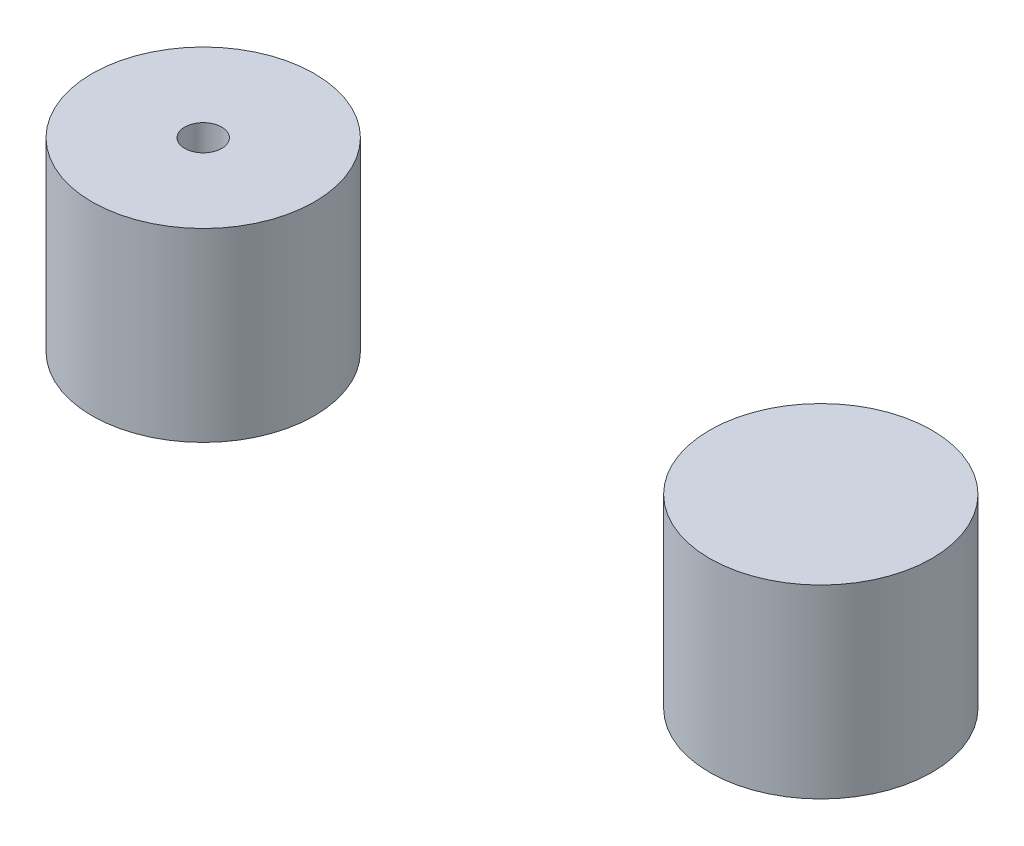
ISO-10303-21;
HEADER;
FILE_DESCRIPTION(('STEP AP214'),'2;1');
FILE_NAME('part.step','',(''),(''),'','','');
FILE_SCHEMA(('AUTOMOTIVE_DESIGN { 1 0 10303 214 1 1 1 1 }'));
ENDSEC;
DATA;
#1=APPLICATION_CONTEXT('core data for automotive mechanical design processes');
#2=APPLICATION_PROTOCOL_DEFINITION('international standard','automotive_design',2000,#1);
#3=PRODUCT_CONTEXT('',#1,'mechanical');
#4=PRODUCT('Part','Part','',(#3));
#5=PRODUCT_RELATED_PRODUCT_CATEGORY('part','',(#4));
#6=PRODUCT_DEFINITION_FORMATION('','',#4);
#7=PRODUCT_DEFINITION_CONTEXT('part definition',#1,'design');
#8=PRODUCT_DEFINITION('design','',#6,#7);
#9=PRODUCT_DEFINITION_SHAPE('','',#8);
#10=(LENGTH_UNIT() NAMED_UNIT(*) SI_UNIT(.MILLI.,.METRE.));
#11=(NAMED_UNIT(*) PLANE_ANGLE_UNIT() SI_UNIT($,.RADIAN.));
#12=(NAMED_UNIT(*) SI_UNIT($,.STERADIAN.) SOLID_ANGLE_UNIT());
#13=UNCERTAINTY_MEASURE_WITH_UNIT(LENGTH_MEASURE(1.E-05),#10,'distance_accuracy_value','');
#14=(GEOMETRIC_REPRESENTATION_CONTEXT(3) GLOBAL_UNCERTAINTY_ASSIGNED_CONTEXT((#13)) GLOBAL_UNIT_ASSIGNED_CONTEXT((#10,
#11,#12)) REPRESENTATION_CONTEXT('',''));
#15=CARTESIAN_POINT('',(0.,0.,0.));
#16=DIRECTION('',(0.,0.,1.));
#17=DIRECTION('',(1.,0.,0.));
#18=AXIS2_PLACEMENT_3D('',#15,#16,#17);
#19=CARTESIAN_POINT('',(10.,3.,0.));
#20=DIRECTION('',(0.,-1.,0.));
#21=DIRECTION('',(0.,0.,-1.));
#22=AXIS2_PLACEMENT_3D('',#19,#20,#21);
#23=CYLINDRICAL_SURFACE('',#22,1.8);
#24=CARTESIAN_POINT('',(10.,3.,0.));
#25=DIRECTION('',(0.,1.,0.));
#26=DIRECTION('',(0.,0.,1.));
#27=AXIS2_PLACEMENT_3D('',#24,#25,#26);
#28=CIRCLE('',#27,1.8);
#29=CARTESIAN_POINT('',(10.,3.,1.8));
#30=VERTEX_POINT('',#29);
#31=EDGE_CURVE('E53',#30,#30,#28,.T.);
#32=ORIENTED_EDGE('',*,*,#31,.F.);
#33=EDGE_LOOP('',(#32));
#34=FACE_BOUND('',#33,.T.);
#35=CARTESIAN_POINT('',(10.,0.,0.));
#36=DIRECTION('',(0.,1.,0.));
#37=DIRECTION('',(0.,0.,1.));
#38=AXIS2_PLACEMENT_3D('',#35,#36,#37);
#39=CIRCLE('',#38,1.8);
#40=CARTESIAN_POINT('',(10.,0.,1.8));
#41=VERTEX_POINT('',#40);
#42=EDGE_CURVE('E11',#41,#41,#39,.T.);
#43=ORIENTED_EDGE('',*,*,#42,.T.);
#44=EDGE_LOOP('',(#43));
#45=FACE_BOUND('',#44,.T.);
#46=ADVANCED_FACE('F49',(#34,#45),#23,.T.);
#47=CARTESIAN_POINT('',(10.,3.,0.));
#48=DIRECTION('',(0.,1.,0.));
#49=DIRECTION('',(0.,0.,1.));
#50=AXIS2_PLACEMENT_3D('',#47,#48,#49);
#51=PLANE('',#50);
#52=ORIENTED_EDGE('',*,*,#31,.T.);
#53=EDGE_LOOP('',(#52));
#54=FACE_BOUND('',#53,.T.);
#55=ADVANCED_FACE('F51',(#54),#51,.T.);
#56=CARTESIAN_POINT('',(10.,0.,0.));
#57=DIRECTION('',(0.,1.,0.));
#58=DIRECTION('',(0.,0.,1.));
#59=AXIS2_PLACEMENT_3D('',#56,#57,#58);
#60=PLANE('',#59);
#61=ORIENTED_EDGE('',*,*,#42,.F.);
#62=EDGE_LOOP('',(#61));
#63=FACE_BOUND('',#62,.T.);
#64=ADVANCED_FACE('F70',(#63),#60,.F.);
#65=CLOSED_SHELL('',(#46,#55,#64));
#66=MANIFOLD_SOLID_BREP('B2',#65);
#67=CARTESIAN_POINT('',(0.,3.,0.));
#68=DIRECTION('',(0.,1.,0.));
#69=DIRECTION('',(0.,0.,1.));
#70=AXIS2_PLACEMENT_3D('',#67,#68,#69);
#71=PLANE('',#70);
#72=CARTESIAN_POINT('',(0.,3.,0.));
#73=DIRECTION('',(0.,1.,0.));
#74=DIRECTION('',(0.,0.,1.));
#75=AXIS2_PLACEMENT_3D('',#72,#73,#74);
#76=CIRCLE('',#75,1.8);
#77=CARTESIAN_POINT('',(0.,3.,1.8));
#78=VERTEX_POINT('',#77);
#79=EDGE_CURVE('E48',#78,#78,#76,.T.);
#80=ORIENTED_EDGE('',*,*,#79,.T.);
#81=EDGE_LOOP('',(#80));
#82=FACE_BOUND('',#81,.T.);
#83=CARTESIAN_POINT('',(0.,3.,0.));
#84=DIRECTION('',(0.,1.,0.));
#85=DIRECTION('',(0.,0.,1.));
#86=AXIS2_PLACEMENT_3D('',#83,#84,#85);
#87=CIRCLE('',#86,0.3);
#88=CARTESIAN_POINT('',(0.,3.,0.3));
#89=VERTEX_POINT('',#88);
#90=EDGE_CURVE('E109',#89,#89,#87,.T.);
#91=ORIENTED_EDGE('',*,*,#90,.F.);
#92=EDGE_LOOP('',(#91));
#93=FACE_BOUND('',#92,.T.);
#94=ADVANCED_FACE('F98',(#82,#93),#71,.T.);
#95=CARTESIAN_POINT('',(0.,0.,0.));
#96=DIRECTION('',(0.,1.,0.));
#97=DIRECTION('',(0.,0.,1.));
#98=AXIS2_PLACEMENT_3D('',#95,#96,#97);
#99=PLANE('',#98);
#100=CARTESIAN_POINT('',(0.,0.,0.));
#101=DIRECTION('',(0.,1.,0.));
#102=DIRECTION('',(0.,0.,1.));
#103=AXIS2_PLACEMENT_3D('',#100,#101,#102);
#104=CIRCLE('',#103,1.8);
#105=CARTESIAN_POINT('',(0.,0.,1.8));
#106=VERTEX_POINT('',#105);
#107=EDGE_CURVE('E102',#106,#106,#104,.T.);
#108=ORIENTED_EDGE('',*,*,#107,.F.);
#109=EDGE_LOOP('',(#108));
#110=FACE_BOUND('',#109,.T.);
#111=CARTESIAN_POINT('',(0.,0.,0.));
#112=DIRECTION('',(0.,1.,0.));
#113=DIRECTION('',(0.,0.,1.));
#114=AXIS2_PLACEMENT_3D('',#111,#112,#113);
#115=CIRCLE('',#114,0.3);
#116=CARTESIAN_POINT('',(0.,0.,0.3));
#117=VERTEX_POINT('',#116);
#118=EDGE_CURVE('E111',#117,#117,#115,.T.);
#119=ORIENTED_EDGE('',*,*,#118,.T.);
#120=EDGE_LOOP('',(#119));
#121=FACE_BOUND('',#120,.T.);
#122=ADVANCED_FACE('F121',(#110,#121),#99,.F.);
#123=CARTESIAN_POINT('',(0.,3.,0.));
#124=DIRECTION('',(0.,-1.,0.));
#125=DIRECTION('',(0.,0.,-1.));
#126=AXIS2_PLACEMENT_3D('',#123,#124,#125);
#127=CYLINDRICAL_SURFACE('',#126,1.8);
#128=ORIENTED_EDGE('',*,*,#79,.F.);
#129=EDGE_LOOP('',(#128));
#130=FACE_BOUND('',#129,.T.);
#131=ORIENTED_EDGE('',*,*,#107,.T.);
#132=EDGE_LOOP('',(#131));
#133=FACE_BOUND('',#132,.T.);
#134=ADVANCED_FACE('F100',(#130,#133),#127,.T.);
#135=CARTESIAN_POINT('',(0.,3.,0.));
#136=DIRECTION('',(0.,-1.,0.));
#137=DIRECTION('',(0.,0.,-1.));
#138=AXIS2_PLACEMENT_3D('',#135,#136,#137);
#139=CYLINDRICAL_SURFACE('',#138,0.3);
#140=ORIENTED_EDGE('',*,*,#90,.T.);
#141=EDGE_LOOP('',(#140));
#142=FACE_BOUND('',#141,.T.);
#143=ORIENTED_EDGE('',*,*,#118,.F.);
#144=EDGE_LOOP('',(#143));
#145=FACE_BOUND('',#144,.T.);
#146=ADVANCED_FACE('F117',(#142,#145),#139,.F.);
#147=CLOSED_SHELL('',(#94,#122,#134,#146));
#148=MANIFOLD_SOLID_BREP('B6',#147);
#149=ADVANCED_BREP_SHAPE_REPRESENTATION('',(#18,#66,#148),#14);
#150=SHAPE_DEFINITION_REPRESENTATION(#9,#149);
ENDSEC;
END-ISO-10303-21;
